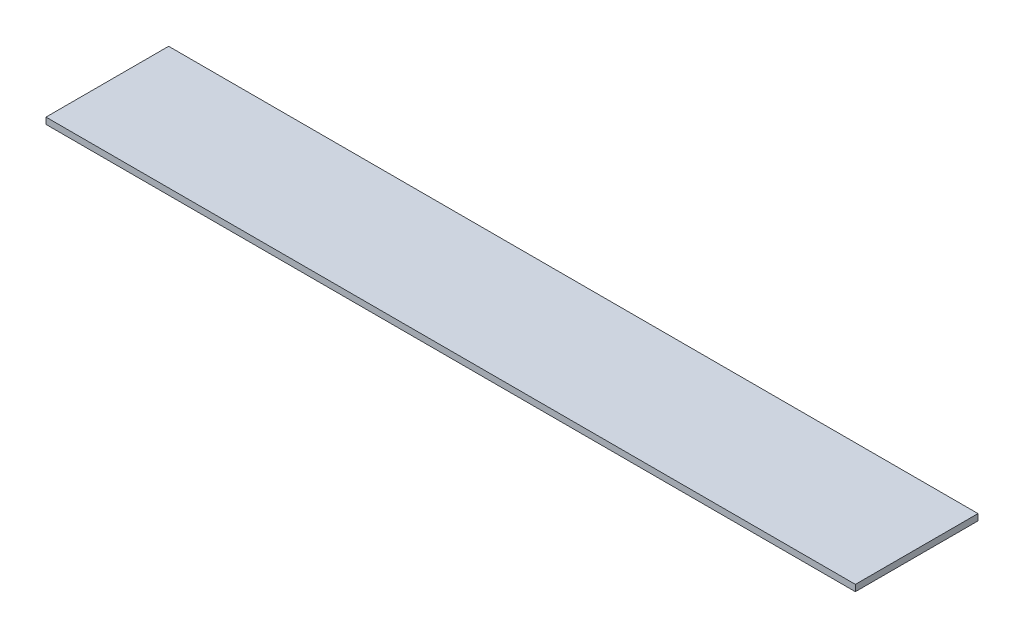
ISO-10303-21;
HEADER;
FILE_DESCRIPTION(('STEP AP214'),'2;1');
FILE_NAME('part.step','',(''),(''),'','','');
FILE_SCHEMA(('AUTOMOTIVE_DESIGN { 1 0 10303 214 1 1 1 1 }'));
ENDSEC;
DATA;
#1=APPLICATION_CONTEXT('core data for automotive mechanical design processes');
#2=APPLICATION_PROTOCOL_DEFINITION('international standard','automotive_design',2000,#1);
#3=PRODUCT_CONTEXT('',#1,'mechanical');
#4=PRODUCT('Part','Part','',(#3));
#5=PRODUCT_RELATED_PRODUCT_CATEGORY('part','',(#4));
#6=PRODUCT_DEFINITION_FORMATION('','',#4);
#7=PRODUCT_DEFINITION_CONTEXT('part definition',#1,'design');
#8=PRODUCT_DEFINITION('design','',#6,#7);
#9=PRODUCT_DEFINITION_SHAPE('','',#8);
#10=(LENGTH_UNIT() NAMED_UNIT(*) SI_UNIT(.MILLI.,.METRE.));
#11=(NAMED_UNIT(*) PLANE_ANGLE_UNIT() SI_UNIT($,.RADIAN.));
#12=(NAMED_UNIT(*) SI_UNIT($,.STERADIAN.) SOLID_ANGLE_UNIT());
#13=UNCERTAINTY_MEASURE_WITH_UNIT(LENGTH_MEASURE(1.E-05),#10,'distance_accuracy_value','');
#14=(GEOMETRIC_REPRESENTATION_CONTEXT(3) GLOBAL_UNCERTAINTY_ASSIGNED_CONTEXT((#13)) GLOBAL_UNIT_ASSIGNED_CONTEXT((#10,
#11,#12)) REPRESENTATION_CONTEXT('',''));
#15=CARTESIAN_POINT('',(0.,0.,0.));
#16=DIRECTION('',(0.,0.,1.));
#17=DIRECTION('',(1.,0.,0.));
#18=AXIS2_PLACEMENT_3D('',#15,#16,#17);
#19=CARTESIAN_POINT('',(314.325,4.953,47.625));
#20=DIRECTION('',(-1.,0.,0.));
#21=DIRECTION('',(0.,0.,1.));
#22=AXIS2_PLACEMENT_3D('',#19,#20,#21);
#23=PLANE('',#22);
#24=DIRECTION('',(0.,0.,-1.));
#25=VECTOR('',#24,1.);
#26=CARTESIAN_POINT('',(314.325,0.,47.625));
#27=LINE('',#26,#25);
#28=CARTESIAN_POINT('',(314.325,0.,47.625));
#29=VERTEX_POINT('',#28);
#30=CARTESIAN_POINT('',(314.325,0.,-47.625));
#31=VERTEX_POINT('',#30);
#32=EDGE_CURVE('E113',#29,#31,#27,.T.);
#33=ORIENTED_EDGE('',*,*,#32,.T.);
#34=DIRECTION('',(0.,-1.,0.));
#35=VECTOR('',#34,1.);
#36=CARTESIAN_POINT('',(314.325,4.953,-47.625));
#37=LINE('',#36,#35);
#38=CARTESIAN_POINT('',(314.325,4.953,-47.625));
#39=VERTEX_POINT('',#38);
#40=EDGE_CURVE('E11',#39,#31,#37,.T.);
#41=ORIENTED_EDGE('',*,*,#40,.F.);
#42=DIRECTION('',(0.,0.,-1.));
#43=VECTOR('',#42,1.);
#44=CARTESIAN_POINT('',(314.325,4.953,47.625));
#45=LINE('',#44,#43);
#46=CARTESIAN_POINT('',(314.325,4.953,47.625));
#47=VERTEX_POINT('',#46);
#48=EDGE_CURVE('E97',#47,#39,#45,.T.);
#49=ORIENTED_EDGE('',*,*,#48,.F.);
#50=DIRECTION('',(0.,-1.,0.));
#51=VECTOR('',#50,1.);
#52=CARTESIAN_POINT('',(314.325,4.953,47.625));
#53=LINE('',#52,#51);
#54=EDGE_CURVE('E109',#47,#29,#53,.T.);
#55=ORIENTED_EDGE('',*,*,#54,.T.);
#56=EDGE_LOOP('',(#33,#41,#49,#55));
#57=FACE_BOUND('',#56,.T.);
#58=ADVANCED_FACE('F43',(#57),#23,.F.);
#59=CARTESIAN_POINT('',(-314.325,4.953,-47.625));
#60=DIRECTION('',(0.,0.,1.));
#61=DIRECTION('',(1.,0.,0.));
#62=AXIS2_PLACEMENT_3D('',#59,#60,#61);
#63=PLANE('',#62);
#64=DIRECTION('',(-1.,0.,0.));
#65=VECTOR('',#64,1.);
#66=CARTESIAN_POINT('',(-314.325,0.,-47.625));
#67=LINE('',#66,#65);
#68=CARTESIAN_POINT('',(-314.325,0.,-47.625));
#69=VERTEX_POINT('',#68);
#70=EDGE_CURVE('E102',#31,#69,#67,.T.);
#71=ORIENTED_EDGE('',*,*,#70,.T.);
#72=DIRECTION('',(0.,-1.,0.));
#73=VECTOR('',#72,1.);
#74=CARTESIAN_POINT('',(-314.325,4.953,-47.625));
#75=LINE('',#74,#73);
#76=CARTESIAN_POINT('',(-314.325,4.953,-47.625));
#77=VERTEX_POINT('',#76);
#78=EDGE_CURVE('E52',#77,#69,#75,.T.);
#79=ORIENTED_EDGE('',*,*,#78,.F.);
#80=DIRECTION('',(-1.,0.,0.));
#81=VECTOR('',#80,1.);
#82=CARTESIAN_POINT('',(-314.325,4.953,-47.625));
#83=LINE('',#82,#81);
#84=EDGE_CURVE('E92',#39,#77,#83,.T.);
#85=ORIENTED_EDGE('',*,*,#84,.F.);
#86=ORIENTED_EDGE('',*,*,#40,.T.);
#87=EDGE_LOOP('',(#71,#79,#85,#86));
#88=FACE_BOUND('',#87,.T.);
#89=ADVANCED_FACE('F101',(#88),#63,.F.);
#90=CARTESIAN_POINT('',(-314.325,4.953,47.625));
#91=DIRECTION('',(1.,0.,0.));
#92=DIRECTION('',(0.,0.,-1.));
#93=AXIS2_PLACEMENT_3D('',#90,#91,#92);
#94=PLANE('',#93);
#95=DIRECTION('',(0.,0.,1.));
#96=VECTOR('',#95,1.);
#97=CARTESIAN_POINT('',(-314.325,0.,47.625));
#98=LINE('',#97,#96);
#99=CARTESIAN_POINT('',(-314.325,0.,47.625));
#100=VERTEX_POINT('',#99);
#101=EDGE_CURVE('E79',#69,#100,#98,.T.);
#102=ORIENTED_EDGE('',*,*,#101,.T.);
#103=DIRECTION('',(0.,-1.,0.));
#104=VECTOR('',#103,1.);
#105=CARTESIAN_POINT('',(-314.325,4.953,47.625));
#106=LINE('',#105,#104);
#107=CARTESIAN_POINT('',(-314.325,4.953,47.625));
#108=VERTEX_POINT('',#107);
#109=EDGE_CURVE('E104',#108,#100,#106,.T.);
#110=ORIENTED_EDGE('',*,*,#109,.F.);
#111=DIRECTION('',(0.,0.,1.));
#112=VECTOR('',#111,1.);
#113=CARTESIAN_POINT('',(-314.325,4.953,47.625));
#114=LINE('',#113,#112);
#115=EDGE_CURVE('E95',#77,#108,#114,.T.);
#116=ORIENTED_EDGE('',*,*,#115,.F.);
#117=ORIENTED_EDGE('',*,*,#78,.T.);
#118=EDGE_LOOP('',(#102,#110,#116,#117));
#119=FACE_BOUND('',#118,.T.);
#120=ADVANCED_FACE('F105',(#119),#94,.F.);
#121=CARTESIAN_POINT('',(-314.325,4.953,47.625));
#122=DIRECTION('',(0.,0.,-1.));
#123=DIRECTION('',(-1.,0.,0.));
#124=AXIS2_PLACEMENT_3D('',#121,#122,#123);
#125=PLANE('',#124);
#126=DIRECTION('',(1.,0.,0.));
#127=VECTOR('',#126,1.);
#128=CARTESIAN_POINT('',(-314.325,0.,47.625));
#129=LINE('',#128,#127);
#130=EDGE_CURVE('E85',#100,#29,#129,.T.);
#131=ORIENTED_EDGE('',*,*,#130,.T.);
#132=ORIENTED_EDGE('',*,*,#54,.F.);
#133=DIRECTION('',(1.,0.,0.));
#134=VECTOR('',#133,1.);
#135=CARTESIAN_POINT('',(-314.325,4.953,47.625));
#136=LINE('',#135,#134);
#137=EDGE_CURVE('E60',#108,#47,#136,.T.);
#138=ORIENTED_EDGE('',*,*,#137,.F.);
#139=ORIENTED_EDGE('',*,*,#109,.T.);
#140=EDGE_LOOP('',(#131,#132,#138,#139));
#141=FACE_BOUND('',#140,.T.);
#142=ADVANCED_FACE('F126',(#141),#125,.F.);
#143=CARTESIAN_POINT('',(0.,4.953,0.));
#144=DIRECTION('',(0.,-1.,0.));
#145=DIRECTION('',(0.,0.,-1.));
#146=AXIS2_PLACEMENT_3D('',#143,#144,#145);
#147=PLANE('',#146);
#148=ORIENTED_EDGE('',*,*,#48,.T.);
#149=ORIENTED_EDGE('',*,*,#84,.T.);
#150=ORIENTED_EDGE('',*,*,#115,.T.);
#151=ORIENTED_EDGE('',*,*,#137,.T.);
#152=EDGE_LOOP('',(#148,#149,#150,#151));
#153=FACE_BOUND('',#152,.T.);
#154=ADVANCED_FACE('F93',(#153),#147,.F.);
#155=CARTESIAN_POINT('',(0.,0.,0.));
#156=DIRECTION('',(0.,-1.,0.));
#157=DIRECTION('',(0.,0.,-1.));
#158=AXIS2_PLACEMENT_3D('',#155,#156,#157);
#159=PLANE('',#158);
#160=ORIENTED_EDGE('',*,*,#32,.F.);
#161=ORIENTED_EDGE('',*,*,#130,.F.);
#162=ORIENTED_EDGE('',*,*,#101,.F.);
#163=ORIENTED_EDGE('',*,*,#70,.F.);
#164=EDGE_LOOP('',(#160,#161,#162,#163));
#165=FACE_BOUND('',#164,.T.);
#166=ADVANCED_FACE('F129',(#165),#159,.T.);
#167=CLOSED_SHELL('',(#58,#89,#120,#142,#154,#166));
#168=MANIFOLD_SOLID_BREP('B2',#167);
#169=ADVANCED_BREP_SHAPE_REPRESENTATION('',(#18,#168),#14);
#170=SHAPE_DEFINITION_REPRESENTATION(#9,#169);
ENDSEC;
END-ISO-10303-21;
